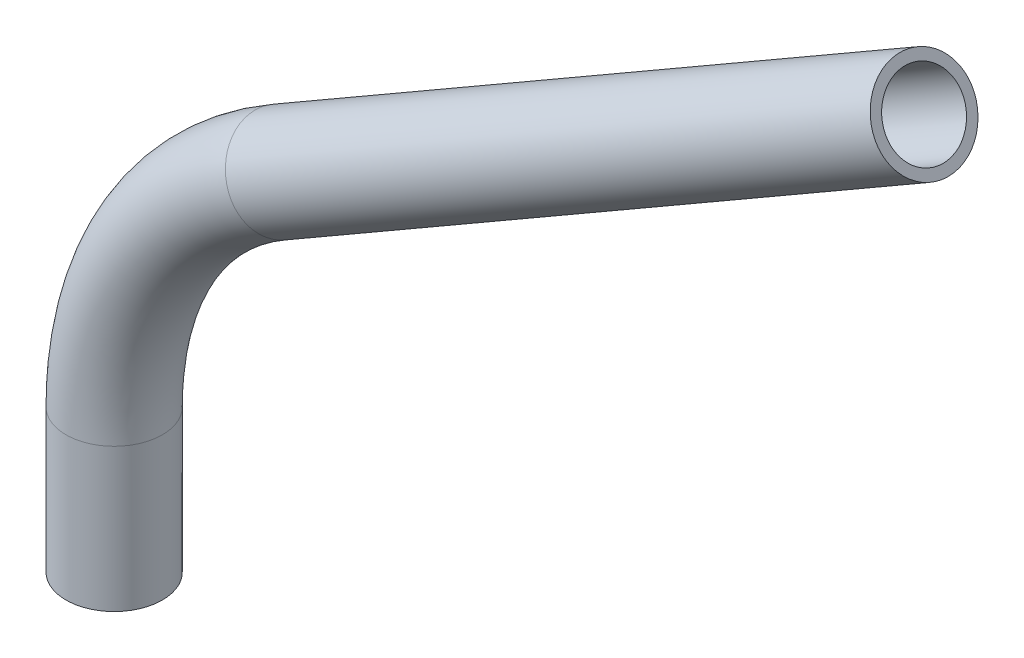
ISO-10303-21;
HEADER;
FILE_DESCRIPTION(('STEP AP214'),'2;1');
FILE_NAME('part.step','',(''),(''),'','','');
FILE_SCHEMA(('AUTOMOTIVE_DESIGN { 1 0 10303 214 1 1 1 1 }'));
ENDSEC;
DATA;
#1=APPLICATION_CONTEXT('core data for automotive mechanical design processes');
#2=APPLICATION_PROTOCOL_DEFINITION('international standard','automotive_design',2000,#1);
#3=PRODUCT_CONTEXT('',#1,'mechanical');
#4=PRODUCT('Part','Part','',(#3));
#5=PRODUCT_RELATED_PRODUCT_CATEGORY('part','',(#4));
#6=PRODUCT_DEFINITION_FORMATION('','',#4);
#7=PRODUCT_DEFINITION_CONTEXT('part definition',#1,'design');
#8=PRODUCT_DEFINITION('design','',#6,#7);
#9=PRODUCT_DEFINITION_SHAPE('','',#8);
#10=(LENGTH_UNIT() NAMED_UNIT(*) SI_UNIT(.MILLI.,.METRE.));
#11=(NAMED_UNIT(*) PLANE_ANGLE_UNIT() SI_UNIT($,.RADIAN.));
#12=(NAMED_UNIT(*) SI_UNIT($,.STERADIAN.) SOLID_ANGLE_UNIT());
#13=UNCERTAINTY_MEASURE_WITH_UNIT(LENGTH_MEASURE(1.E-05),#10,'distance_accuracy_value','');
#14=(GEOMETRIC_REPRESENTATION_CONTEXT(3) GLOBAL_UNCERTAINTY_ASSIGNED_CONTEXT((#13)) GLOBAL_UNIT_ASSIGNED_CONTEXT((#10,
#11,#12)) REPRESENTATION_CONTEXT('',''));
#15=CARTESIAN_POINT('',(0.,0.,0.));
#16=DIRECTION('',(0.,0.,1.));
#17=DIRECTION('',(1.,0.,0.));
#18=AXIS2_PLACEMENT_3D('',#15,#16,#17);
#19=CARTESIAN_POINT('',(0.,14.138,0.));
#20=DIRECTION('',(0.,-1.,0.));
#21=DIRECTION('',(0.,0.,-1.));
#22=AXIS2_PLACEMENT_3D('',#19,#20,#21);
#23=CYLINDRICAL_SURFACE('',#22,3.75);
#24=CARTESIAN_POINT('',(0.,0.,0.));
#25=DIRECTION('',(0.,-1.,0.));
#26=DIRECTION('',(0.,0.,-1.));
#27=AXIS2_PLACEMENT_3D('',#24,#25,#26);
#28=CIRCLE('',#27,3.75);
#29=CARTESIAN_POINT('',(0.,0.,-3.75));
#30=VERTEX_POINT('',#29);
#31=EDGE_CURVE('E17',#30,#30,#28,.F.);
#32=ORIENTED_EDGE('',*,*,#31,.F.);
#33=EDGE_LOOP('',(#32));
#34=FACE_BOUND('',#33,.T.);
#35=CARTESIAN_POINT('',(0.,14.138,0.));
#36=DIRECTION('',(0.,-1.,0.));
#37=DIRECTION('',(-1.,0.,0.));
#38=AXIS2_PLACEMENT_3D('',#35,#36,#37);
#39=CIRCLE('',#38,3.75);
#40=CARTESIAN_POINT('',(-3.75000000000001,14.138,0.));
#41=VERTEX_POINT('',#40);
#42=EDGE_CURVE('E30',#41,#41,#39,.F.);
#43=ORIENTED_EDGE('',*,*,#42,.T.);
#44=EDGE_LOOP('',(#43));
#45=FACE_BOUND('',#44,.T.);
#46=ADVANCED_FACE('F14',(#34,#45),#23,.F.);
#47=CARTESIAN_POINT('',(0.,0.,0.));
#48=DIRECTION('',(0.,-1.,0.));
#49=DIRECTION('',(0.,0.,-1.));
#50=AXIS2_PLACEMENT_3D('',#47,#48,#49);
#51=PLANE('',#50);
#52=ORIENTED_EDGE('',*,*,#31,.T.);
#53=EDGE_LOOP('',(#52));
#54=FACE_BOUND('',#53,.T.);
#55=CARTESIAN_POINT('',(0.,0.,0.));
#56=DIRECTION('',(0.,-1.,0.));
#57=DIRECTION('',(0.,0.,-1.));
#58=AXIS2_PLACEMENT_3D('',#55,#56,#57);
#59=CIRCLE('',#58,4.7625);
#60=CARTESIAN_POINT('',(0.,0.,-4.7625));
#61=VERTEX_POINT('',#60);
#62=EDGE_CURVE('E34',#61,#61,#59,.F.);
#63=ORIENTED_EDGE('',*,*,#62,.F.);
#64=EDGE_LOOP('',(#63));
#65=FACE_BOUND('',#64,.T.);
#66=ADVANCED_FACE('F47',(#54,#65),#51,.T.);
#67=CARTESIAN_POINT('',(32.61805804037,14.138,0.));
#68=DIRECTION('',(0.,0.,1.));
#69=DIRECTION('',(0.500000000000017,-0.866025403784429,0.));
#70=AXIS2_PLACEMENT_3D('',#67,#68,#69);
#71=TOROIDAL_SURFACE('',#70,32.61805804037,3.75);
#72=ORIENTED_EDGE('',*,*,#42,.F.);
#73=EDGE_LOOP('',(#72));
#74=FACE_BOUND('',#73,.T.);
#75=CARTESIAN_POINT('',(16.3090290201834,42.3860668850726,0.));
#76=DIRECTION('',(-0.866025403784429,-0.500000000000017,0.));
#77=DIRECTION('',(0.500000000000017,-0.866025403784429,0.));
#78=AXIS2_PLACEMENT_3D('',#75,#76,#77);
#79=CIRCLE('',#78,3.75);
#80=CARTESIAN_POINT('',(18.1840290201835,39.138471620881,0.));
#81=VERTEX_POINT('',#80);
#82=EDGE_CURVE('E36',#81,#81,#79,.F.);
#83=ORIENTED_EDGE('',*,*,#82,.T.);
#84=EDGE_LOOP('',(#83));
#85=FACE_BOUND('',#84,.T.);
#86=ADVANCED_FACE('F55',(#74,#85),#71,.F.);
#87=CARTESIAN_POINT('',(0.,14.138,0.));
#88=DIRECTION('',(0.,-1.,0.));
#89=DIRECTION('',(0.,0.,-1.));
#90=AXIS2_PLACEMENT_3D('',#87,#88,#89);
#91=CYLINDRICAL_SURFACE('',#90,4.7625);
#92=ORIENTED_EDGE('',*,*,#62,.T.);
#93=EDGE_LOOP('',(#92));
#94=FACE_BOUND('',#93,.T.);
#95=CARTESIAN_POINT('',(0.,14.138,0.));
#96=DIRECTION('',(0.,-1.,0.));
#97=DIRECTION('',(-1.,0.,0.));
#98=AXIS2_PLACEMENT_3D('',#95,#96,#97);
#99=CIRCLE('',#98,4.7625);
#100=CARTESIAN_POINT('',(-4.76250000000001,14.138,0.));
#101=VERTEX_POINT('',#100);
#102=EDGE_CURVE('E33',#101,#101,#99,.F.);
#103=ORIENTED_EDGE('',*,*,#102,.F.);
#104=EDGE_LOOP('',(#103));
#105=FACE_BOUND('',#104,.T.);
#106=ADVANCED_FACE('F80',(#94,#105),#91,.T.);
#107=CARTESIAN_POINT('',(80.,79.15806612522,0.));
#108=DIRECTION('',(-0.866025403784429,-0.500000000000017,0.));
#109=DIRECTION('',(0.500000000000017,-0.866025403784429,0.));
#110=AXIS2_PLACEMENT_3D('',#107,#108,#109);
#111=CYLINDRICAL_SURFACE('',#110,3.75);
#112=ORIENTED_EDGE('',*,*,#82,.F.);
#113=EDGE_LOOP('',(#112));
#114=FACE_BOUND('',#113,.T.);
#115=CARTESIAN_POINT('',(80.0000000000007,79.1580661252204,0.));
#116=DIRECTION('',(-0.866025403784429,-0.500000000000017,0.));
#117=DIRECTION('',(0.500000000000017,-0.866025403784429,0.));
#118=AXIS2_PLACEMENT_3D('',#115,#116,#117);
#119=CIRCLE('',#118,3.75);
#120=CARTESIAN_POINT('',(81.8750000000007,75.9104708610288,0.));
#121=VERTEX_POINT('',#120);
#122=EDGE_CURVE('E26',#121,#121,#119,.F.);
#123=ORIENTED_EDGE('',*,*,#122,.T.);
#124=EDGE_LOOP('',(#123));
#125=FACE_BOUND('',#124,.T.);
#126=ADVANCED_FACE('F71',(#114,#125),#111,.F.);
#127=CARTESIAN_POINT('',(32.61805804037,14.138,0.));
#128=DIRECTION('',(0.,0.,1.));
#129=DIRECTION('',(0.500000000000017,-0.866025403784429,0.));
#130=AXIS2_PLACEMENT_3D('',#127,#128,#129);
#131=TOROIDAL_SURFACE('',#130,32.61805804037,4.7625);
#132=ORIENTED_EDGE('',*,*,#102,.T.);
#133=EDGE_LOOP('',(#132));
#134=FACE_BOUND('',#133,.T.);
#135=CARTESIAN_POINT('',(16.3090290201827,42.3860668850722,0.));
#136=DIRECTION('',(-0.866025403784429,-0.500000000000017,0.));
#137=DIRECTION('',(0.500000000000017,-0.866025403784429,0.));
#138=AXIS2_PLACEMENT_3D('',#135,#136,#137);
#139=CIRCLE('',#138,4.7625);
#140=CARTESIAN_POINT('',(18.6902790201827,38.2616208995488,0.));
#141=VERTEX_POINT('',#140);
#142=EDGE_CURVE('E21',#141,#141,#139,.F.);
#143=ORIENTED_EDGE('',*,*,#142,.F.);
#144=EDGE_LOOP('',(#143));
#145=FACE_BOUND('',#144,.T.);
#146=ADVANCED_FACE('F64',(#134,#145),#131,.T.);
#147=CARTESIAN_POINT('',(80.,79.15806612522,0.));
#148=DIRECTION('',(-0.866025403784429,-0.500000000000017,0.));
#149=DIRECTION('',(0.500000000000017,-0.866025403784429,0.));
#150=AXIS2_PLACEMENT_3D('',#147,#148,#149);
#151=PLANE('',#150);
#152=ORIENTED_EDGE('',*,*,#122,.F.);
#153=EDGE_LOOP('',(#152));
#154=FACE_BOUND('',#153,.T.);
#155=CARTESIAN_POINT('',(80.0000000000014,79.1580661252208,0.));
#156=DIRECTION('',(-0.866025403784429,-0.500000000000017,0.));
#157=DIRECTION('',(0.500000000000017,-0.866025403784429,0.));
#158=AXIS2_PLACEMENT_3D('',#155,#156,#157);
#159=CIRCLE('',#158,4.7625);
#160=CARTESIAN_POINT('',(82.3812500000015,75.0336201396974,0.));
#161=VERTEX_POINT('',#160);
#162=EDGE_CURVE('E10',#161,#161,#159,.T.);
#163=ORIENTED_EDGE('',*,*,#162,.F.);
#164=EDGE_LOOP('',(#163));
#165=FACE_BOUND('',#164,.T.);
#166=ADVANCED_FACE('F58',(#154,#165),#151,.F.);
#167=CARTESIAN_POINT('',(80.,79.15806612522,0.));
#168=DIRECTION('',(-0.866025403784429,-0.500000000000017,0.));
#169=DIRECTION('',(0.500000000000017,-0.866025403784429,0.));
#170=AXIS2_PLACEMENT_3D('',#167,#168,#169);
#171=CYLINDRICAL_SURFACE('',#170,4.7625);
#172=ORIENTED_EDGE('',*,*,#142,.T.);
#173=EDGE_LOOP('',(#172));
#174=FACE_BOUND('',#173,.T.);
#175=ORIENTED_EDGE('',*,*,#162,.T.);
#176=EDGE_LOOP('',(#175));
#177=FACE_BOUND('',#176,.T.);
#178=ADVANCED_FACE('F56',(#174,#177),#171,.T.);
#179=CLOSED_SHELL('',(#46,#66,#86,#106,#126,#146,#166,#178));
#180=MANIFOLD_SOLID_BREP('B1',#179);
#181=ADVANCED_BREP_SHAPE_REPRESENTATION('',(#18,#180),#14);
#182=SHAPE_DEFINITION_REPRESENTATION(#9,#181);
ENDSEC;
END-ISO-10303-21;
